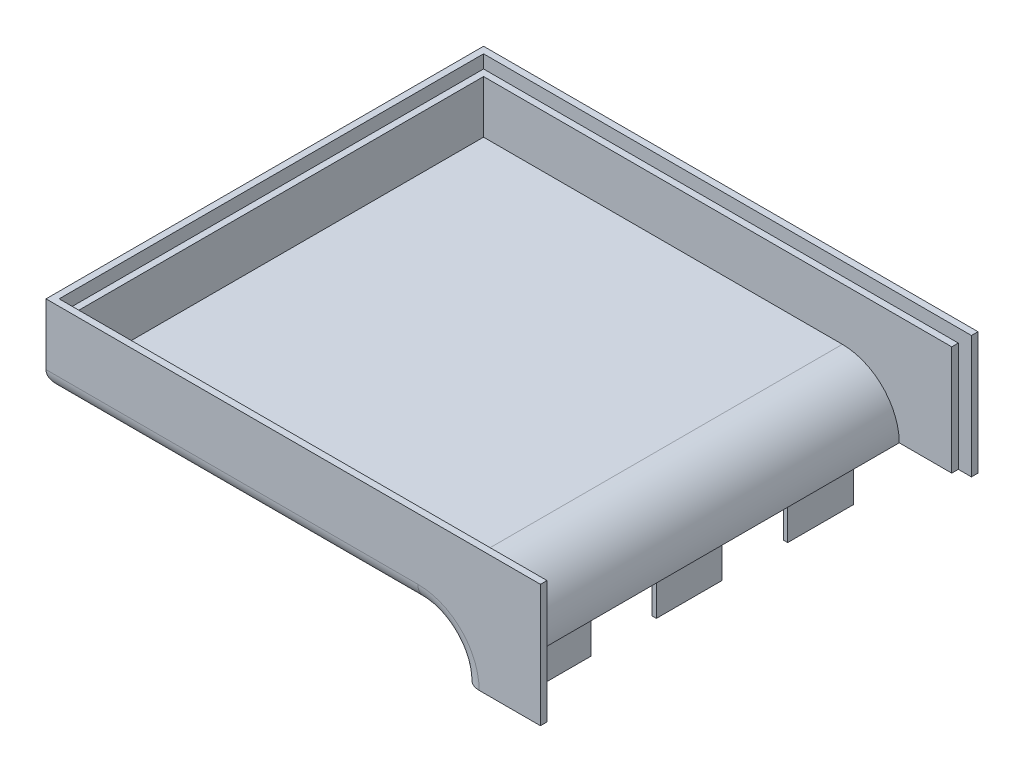
ISO-10303-21;
HEADER;
FILE_DESCRIPTION(('STEP AP214'),'2;1');
FILE_NAME('part.step','',(''),(''),'','','');
FILE_SCHEMA(('AUTOMOTIVE_DESIGN { 1 0 10303 214 1 1 1 1 }'));
ENDSEC;
DATA;
#1=APPLICATION_CONTEXT('core data for automotive mechanical design processes');
#2=APPLICATION_PROTOCOL_DEFINITION('international standard','automotive_design',2000,#1);
#3=PRODUCT_CONTEXT('',#1,'mechanical');
#4=PRODUCT('Part','Part','',(#3));
#5=PRODUCT_RELATED_PRODUCT_CATEGORY('part','',(#4));
#6=PRODUCT_DEFINITION_FORMATION('','',#4);
#7=PRODUCT_DEFINITION_CONTEXT('part definition',#1,'design');
#8=PRODUCT_DEFINITION('design','',#6,#7);
#9=PRODUCT_DEFINITION_SHAPE('','',#8);
#10=(LENGTH_UNIT() NAMED_UNIT(*) SI_UNIT(.MILLI.,.METRE.));
#11=(NAMED_UNIT(*) PLANE_ANGLE_UNIT() SI_UNIT($,.RADIAN.));
#12=(NAMED_UNIT(*) SI_UNIT($,.STERADIAN.) SOLID_ANGLE_UNIT());
#13=UNCERTAINTY_MEASURE_WITH_UNIT(LENGTH_MEASURE(1.E-05),#10,'distance_accuracy_value','');
#14=(GEOMETRIC_REPRESENTATION_CONTEXT(3) GLOBAL_UNCERTAINTY_ASSIGNED_CONTEXT((#13)) GLOBAL_UNIT_ASSIGNED_CONTEXT((#10,
#11,#12)) REPRESENTATION_CONTEXT('',''));
#15=CARTESIAN_POINT('',(0.,0.,0.));
#16=DIRECTION('',(0.,0.,1.));
#17=DIRECTION('',(1.,0.,0.));
#18=AXIS2_PLACEMENT_3D('',#15,#16,#17);
#19=CARTESIAN_POINT('',(0.,340.,0.));
#20=DIRECTION('',(0.,1.,0.));
#21=DIRECTION('',(0.,0.,1.));
#22=AXIS2_PLACEMENT_3D('',#19,#20,#21);
#23=PLANE('',#22);
#24=DIRECTION('',(0.,0.,-1.));
#25=VECTOR('',#24,1.);
#26=CARTESIAN_POINT('',(-14.,340.,57.5));
#27=LINE('',#26,#25);
#28=CARTESIAN_POINT('',(-14.,340.,57.5));
#29=VERTEX_POINT('',#28);
#30=CARTESIAN_POINT('',(-14.,340.,42.5));
#31=VERTEX_POINT('',#30);
#32=EDGE_CURVE('E270',#29,#31,#27,.T.);
#33=ORIENTED_EDGE('',*,*,#32,.F.);
#34=DIRECTION('',(-1.,0.,0.));
#35=VECTOR('',#34,1.);
#36=CARTESIAN_POINT('',(-14.,340.,57.5));
#37=LINE('',#36,#35);
#38=CARTESIAN_POINT('',(-13.,340.,57.5));
#39=VERTEX_POINT('',#38);
#40=EDGE_CURVE('E283',#39,#29,#37,.T.);
#41=ORIENTED_EDGE('',*,*,#40,.F.);
#42=DIRECTION('',(0.,0.,1.));
#43=VECTOR('',#42,1.);
#44=CARTESIAN_POINT('',(-13.,340.,57.5));
#45=LINE('',#44,#43);
#46=CARTESIAN_POINT('',(-13.,340.,42.5));
#47=VERTEX_POINT('',#46);
#48=EDGE_CURVE('E292',#47,#39,#45,.T.);
#49=ORIENTED_EDGE('',*,*,#48,.F.);
#50=DIRECTION('',(1.,0.,0.));
#51=VECTOR('',#50,1.);
#52=CARTESIAN_POINT('',(-14.,340.,42.5));
#53=LINE('',#52,#51);
#54=EDGE_CURVE('E273',#31,#47,#53,.T.);
#55=ORIENTED_EDGE('',*,*,#54,.F.);
#56=EDGE_LOOP('',(#33,#41,#49,#55));
#57=FACE_BOUND('',#56,.T.);
#58=CARTESIAN_POINT('',(-11.,340.,4.));
#59=DIRECTION('',(0.,1.,0.));
#60=DIRECTION('',(0.,0.,1.));
#61=AXIS2_PLACEMENT_3D('',#58,#59,#60);
#62=CIRCLE('',#61,4.);
#63=CARTESIAN_POINT('',(-11.,340.,0.));
#64=VERTEX_POINT('',#63);
#65=CARTESIAN_POINT('',(-15.,340.,4.));
#66=VERTEX_POINT('',#65);
#67=EDGE_CURVE('E354',#64,#66,#62,.T.);
#68=ORIENTED_EDGE('',*,*,#67,.F.);
#69=DIRECTION('',(1.,0.,0.));
#70=VECTOR('',#69,1.);
#71=CARTESIAN_POINT('',(-25.0000000000001,340.,0.));
#72=LINE('',#71,#70);
#73=CARTESIAN_POINT('',(3.,340.,0.));
#74=VERTEX_POINT('',#73);
#75=EDGE_CURVE('E474',#64,#74,#72,.T.);
#76=ORIENTED_EDGE('',*,*,#75,.T.);
#77=DIRECTION('',(0.,0.,1.));
#78=VECTOR('',#77,1.);
#79=CARTESIAN_POINT('',(3.,340.,0.));
#80=LINE('',#79,#78);
#81=CARTESIAN_POINT('',(3.,340.,1.5));
#82=VERTEX_POINT('',#81);
#83=EDGE_CURVE('E477',#74,#82,#80,.T.);
#84=ORIENTED_EDGE('',*,*,#83,.T.);
#85=DIRECTION('',(1.,0.,0.));
#86=VECTOR('',#85,1.);
#87=CARTESIAN_POINT('',(3.,340.,1.5));
#88=LINE('',#87,#86);
#89=CARTESIAN_POINT('',(0.,340.,1.5));
#90=VERTEX_POINT('',#89);
#91=EDGE_CURVE('E466',#90,#82,#88,.T.);
#92=ORIENTED_EDGE('',*,*,#91,.F.);
#93=DIRECTION('',(0.,0.,-1.));
#94=VECTOR('',#93,1.);
#95=CARTESIAN_POINT('',(0.,340.,100.));
#96=LINE('',#95,#94);
#97=CARTESIAN_POINT('',(0.,339.999997667742,3.));
#98=VERTEX_POINT('',#97);
#99=EDGE_CURVE('E470',#98,#90,#96,.T.);
#100=ORIENTED_EDGE('',*,*,#99,.F.);
#101=DIRECTION('',(-1.,0.,0.));
#102=VECTOR('',#101,1.);
#103=CARTESIAN_POINT('',(-25.0000000000001,339.999997667742,3.));
#104=LINE('',#103,#102);
#105=CARTESIAN_POINT('',(-12.,339.999997667742,3.));
#106=VERTEX_POINT('',#105);
#107=EDGE_CURVE('E483',#98,#106,#104,.T.);
#108=ORIENTED_EDGE('',*,*,#107,.T.);
#109=DIRECTION('',(0.,0.,1.));
#110=VECTOR('',#109,1.);
#111=CARTESIAN_POINT('',(-12.,340.,100.));
#112=LINE('',#111,#110);
#113=CARTESIAN_POINT('',(-12.,340.,97.));
#114=VERTEX_POINT('',#113);
#115=EDGE_CURVE('E415',#114,#106,#112,.F.);
#116=ORIENTED_EDGE('',*,*,#115,.F.);
#117=DIRECTION('',(-1.,0.,0.));
#118=VECTOR('',#117,1.);
#119=CARTESIAN_POINT('',(-25.0000000000001,340.,97.));
#120=LINE('',#119,#118);
#121=CARTESIAN_POINT('',(0.,340.,97.));
#122=VERTEX_POINT('',#121);
#123=EDGE_CURVE('E358',#122,#114,#120,.T.);
#124=ORIENTED_EDGE('',*,*,#123,.F.);
#125=DIRECTION('',(0.,0.,-1.));
#126=VECTOR('',#125,1.);
#127=CARTESIAN_POINT('',(0.,340.,100.));
#128=LINE('',#127,#126);
#129=CARTESIAN_POINT('',(0.,340.,98.5));
#130=VERTEX_POINT('',#129);
#131=EDGE_CURVE('E472',#130,#122,#128,.T.);
#132=ORIENTED_EDGE('',*,*,#131,.F.);
#133=DIRECTION('',(-1.,0.,0.));
#134=VECTOR('',#133,1.);
#135=CARTESIAN_POINT('',(-108.5,340.,98.5));
#136=LINE('',#135,#134);
#137=CARTESIAN_POINT('',(3.,340.,98.5));
#138=VERTEX_POINT('',#137);
#139=EDGE_CURVE('E464',#138,#130,#136,.T.);
#140=ORIENTED_EDGE('',*,*,#139,.F.);
#141=DIRECTION('',(0.,0.,1.));
#142=VECTOR('',#141,1.);
#143=CARTESIAN_POINT('',(3.,340.,0.));
#144=LINE('',#143,#142);
#145=CARTESIAN_POINT('',(3.,340.,100.));
#146=VERTEX_POINT('',#145);
#147=EDGE_CURVE('E480',#138,#146,#144,.T.);
#148=ORIENTED_EDGE('',*,*,#147,.T.);
#149=DIRECTION('',(1.,0.,0.));
#150=VECTOR('',#149,1.);
#151=CARTESIAN_POINT('',(-25.0000000000001,340.,100.));
#152=LINE('',#151,#150);
#153=CARTESIAN_POINT('',(-11.,340.,100.));
#154=VERTEX_POINT('',#153);
#155=EDGE_CURVE('E468',#154,#146,#152,.T.);
#156=ORIENTED_EDGE('',*,*,#155,.F.);
#157=CARTESIAN_POINT('',(-11.,340.,96.));
#158=DIRECTION('',(0.,-1.,0.));
#159=DIRECTION('',(0.,0.,-1.));
#160=AXIS2_PLACEMENT_3D('',#157,#158,#159);
#161=CIRCLE('',#160,4.);
#162=CARTESIAN_POINT('',(-15.,340.,96.));
#163=VERTEX_POINT('',#162);
#164=EDGE_CURVE('E341',#154,#163,#161,.T.);
#165=ORIENTED_EDGE('',*,*,#164,.T.);
#166=DIRECTION('',(0.,0.,-1.));
#167=VECTOR('',#166,1.);
#168=CARTESIAN_POINT('',(-15.,340.,100.));
#169=LINE('',#168,#167);
#170=EDGE_CURVE('E486',#163,#66,#169,.T.);
#171=ORIENTED_EDGE('',*,*,#170,.T.);
#172=EDGE_LOOP('',(#68,#76,#84,#92,#100,#108,#116,#124,#132,#140,#148,#156,#165,#171));
#173=FACE_BOUND('',#172,.T.);
#174=DIRECTION('',(0.,0.,-1.));
#175=VECTOR('',#174,1.);
#176=CARTESIAN_POINT('',(-14.,340.,87.5));
#177=LINE('',#176,#175);
#178=CARTESIAN_POINT('',(-14.,340.,87.5));
#179=VERTEX_POINT('',#178);
#180=CARTESIAN_POINT('',(-14.,340.,72.5));
#181=VERTEX_POINT('',#180);
#182=EDGE_CURVE('E308',#179,#181,#177,.T.);
#183=ORIENTED_EDGE('',*,*,#182,.F.);
#184=DIRECTION('',(-1.,0.,0.));
#185=VECTOR('',#184,1.);
#186=CARTESIAN_POINT('',(-14.,340.,87.5));
#187=LINE('',#186,#185);
#188=CARTESIAN_POINT('',(-13.,340.,87.5));
#189=VERTEX_POINT('',#188);
#190=EDGE_CURVE('E313',#189,#179,#187,.T.);
#191=ORIENTED_EDGE('',*,*,#190,.F.);
#192=DIRECTION('',(0.,0.,1.));
#193=VECTOR('',#192,1.);
#194=CARTESIAN_POINT('',(-13.,340.,87.5));
#195=LINE('',#194,#193);
#196=CARTESIAN_POINT('',(-13.,340.,72.5));
#197=VERTEX_POINT('',#196);
#198=EDGE_CURVE('E325',#197,#189,#195,.T.);
#199=ORIENTED_EDGE('',*,*,#198,.F.);
#200=DIRECTION('',(1.,0.,0.));
#201=VECTOR('',#200,1.);
#202=CARTESIAN_POINT('',(-14.,340.,72.5));
#203=LINE('',#202,#201);
#204=EDGE_CURVE('E322',#181,#197,#203,.T.);
#205=ORIENTED_EDGE('',*,*,#204,.F.);
#206=EDGE_LOOP('',(#183,#191,#199,#205));
#207=FACE_BOUND('',#206,.T.);
#208=DIRECTION('',(0.,0.,-1.));
#209=VECTOR('',#208,1.);
#210=CARTESIAN_POINT('',(-14.,340.,27.5));
#211=LINE('',#210,#209);
#212=CARTESIAN_POINT('',(-14.,340.,27.5));
#213=VERTEX_POINT('',#212);
#214=CARTESIAN_POINT('',(-14.,340.,12.5));
#215=VERTEX_POINT('',#214);
#216=EDGE_CURVE('E269',#213,#215,#211,.T.);
#217=ORIENTED_EDGE('',*,*,#216,.F.);
#218=DIRECTION('',(-1.,0.,0.));
#219=VECTOR('',#218,1.);
#220=CARTESIAN_POINT('',(-14.,340.,27.5));
#221=LINE('',#220,#219);
#222=CARTESIAN_POINT('',(-13.,340.,27.5));
#223=VERTEX_POINT('',#222);
#224=EDGE_CURVE('E266',#223,#213,#221,.T.);
#225=ORIENTED_EDGE('',*,*,#224,.F.);
#226=DIRECTION('',(0.,0.,1.));
#227=VECTOR('',#226,1.);
#228=CARTESIAN_POINT('',(-13.,340.,27.5));
#229=LINE('',#228,#227);
#230=CARTESIAN_POINT('',(-13.,340.,12.5));
#231=VERTEX_POINT('',#230);
#232=EDGE_CURVE('E55',#231,#223,#229,.T.);
#233=ORIENTED_EDGE('',*,*,#232,.F.);
#234=DIRECTION('',(1.,0.,0.));
#235=VECTOR('',#234,1.);
#236=CARTESIAN_POINT('',(-14.,340.,12.5));
#237=LINE('',#236,#235);
#238=EDGE_CURVE('E50',#215,#231,#237,.T.);
#239=ORIENTED_EDGE('',*,*,#238,.F.);
#240=EDGE_LOOP('',(#217,#225,#233,#239));
#241=FACE_BOUND('',#240,.T.);
#242=ADVANCED_FACE('F33',(#57,#173,#207,#241),#23,.F.);
#243=CARTESIAN_POINT('',(-106.,354.,100.));
#244=DIRECTION('',(0.,0.,-1.));
#245=DIRECTION('',(-1.,0.,0.));
#246=AXIS2_PLACEMENT_3D('',#243,#244,#245);
#247=CYLINDRICAL_SURFACE('',#246,4.);
#248=CARTESIAN_POINT('',(-106.,354.,96.));
#249=DIRECTION('',(-0.707106781186547,0.,-0.707106781186547));
#250=DIRECTION('',(0.707106781186547,0.,-0.707106781186547));
#251=AXIS2_PLACEMENT_3D('',#248,#249,#250);
#252=ELLIPSE('',#251,5.65685424949238,4.);
#253=CARTESIAN_POINT('',(-106.,350.,96.));
#254=VERTEX_POINT('',#253);
#255=CARTESIAN_POINT('',(-110.,354.,100.));
#256=VERTEX_POINT('',#255);
#257=EDGE_CURVE('E345',#254,#256,#252,.T.);
#258=ORIENTED_EDGE('',*,*,#257,.T.);
#259=DIRECTION('',(0.,0.,-1.));
#260=VECTOR('',#259,1.);
#261=CARTESIAN_POINT('',(-110.,354.,100.));
#262=LINE('',#261,#260);
#263=CARTESIAN_POINT('',(-110.,354.,0.));
#264=VERTEX_POINT('',#263);
#265=EDGE_CURVE('E355',#264,#256,#262,.F.);
#266=ORIENTED_EDGE('',*,*,#265,.F.);
#267=CARTESIAN_POINT('',(-106.,354.,4.));
#268=DIRECTION('',(-0.707106781186547,0.,0.707106781186547));
#269=DIRECTION('',(-0.707106781186547,0.,-0.707106781186547));
#270=AXIS2_PLACEMENT_3D('',#267,#268,#269);
#271=ELLIPSE('',#270,5.65685424949238,4.);
#272=CARTESIAN_POINT('',(-106.,350.,4.));
#273=VERTEX_POINT('',#272);
#274=EDGE_CURVE('E349',#273,#264,#271,.F.);
#275=ORIENTED_EDGE('',*,*,#274,.F.);
#276=DIRECTION('',(0.,0.,-1.));
#277=VECTOR('',#276,1.);
#278=CARTESIAN_POINT('',(-106.,350.,100.));
#279=LINE('',#278,#277);
#280=EDGE_CURVE('E360',#254,#273,#279,.T.);
#281=ORIENTED_EDGE('',*,*,#280,.F.);
#282=EDGE_LOOP('',(#258,#266,#275,#281));
#283=FACE_BOUND('',#282,.T.);
#284=ADVANCED_FACE('F599',(#283),#247,.T.);
#285=CARTESIAN_POINT('',(-110.,350.,100.));
#286=DIRECTION('',(0.,1.,0.));
#287=DIRECTION('',(-1.,0.,0.));
#288=AXIS2_PLACEMENT_3D('',#285,#286,#287);
#289=PLANE('',#288);
#290=DIRECTION('',(0.,0.,-1.));
#291=VECTOR('',#290,1.);
#292=CARTESIAN_POINT('',(-25.0000000000001,350.,100.));
#293=LINE('',#292,#291);
#294=CARTESIAN_POINT('',(-25.0000000000001,350.,96.));
#295=VERTEX_POINT('',#294);
#296=CARTESIAN_POINT('',(-25.0000000000001,350.,4.));
#297=VERTEX_POINT('',#296);
#298=EDGE_CURVE('E382',#295,#297,#293,.T.);
#299=ORIENTED_EDGE('',*,*,#298,.F.);
#300=DIRECTION('',(1.,0.,0.));
#301=VECTOR('',#300,1.);
#302=CARTESIAN_POINT('',(-110.,350.,96.));
#303=LINE('',#302,#301);
#304=EDGE_CURVE('E357',#295,#254,#303,.F.);
#305=ORIENTED_EDGE('',*,*,#304,.T.);
#306=ORIENTED_EDGE('',*,*,#280,.T.);
#307=DIRECTION('',(1.,0.,0.));
#308=VECTOR('',#307,1.);
#309=CARTESIAN_POINT('',(-25.0000000000001,350.,4.));
#310=LINE('',#309,#308);
#311=EDGE_CURVE('E362',#273,#297,#310,.T.);
#312=ORIENTED_EDGE('',*,*,#311,.T.);
#313=EDGE_LOOP('',(#299,#305,#306,#312));
#314=FACE_BOUND('',#313,.T.);
#315=ADVANCED_FACE('F577',(#314),#289,.F.);
#316=CARTESIAN_POINT('',(-110.,365.,100.));
#317=DIRECTION('',(1.,0.,0.));
#318=DIRECTION('',(0.,0.,-1.));
#319=AXIS2_PLACEMENT_3D('',#316,#317,#318);
#320=PLANE('',#319);
#321=DIRECTION('',(0.,-1.,0.));
#322=VECTOR('',#321,1.);
#323=CARTESIAN_POINT('',(-110.,365.,0.));
#324=LINE('',#323,#322);
#325=CARTESIAN_POINT('',(-110.,368.,0.));
#326=VERTEX_POINT('',#325);
#327=EDGE_CURVE('E386',#326,#264,#324,.T.);
#328=ORIENTED_EDGE('',*,*,#327,.T.);
#329=ORIENTED_EDGE('',*,*,#265,.T.);
#330=DIRECTION('',(0.,-1.,0.));
#331=VECTOR('',#330,1.);
#332=CARTESIAN_POINT('',(-110.,365.,100.));
#333=LINE('',#332,#331);
#334=CARTESIAN_POINT('',(-110.,368.,100.));
#335=VERTEX_POINT('',#334);
#336=EDGE_CURVE('E385',#335,#256,#333,.T.);
#337=ORIENTED_EDGE('',*,*,#336,.F.);
#338=DIRECTION('',(0.,0.,1.));
#339=VECTOR('',#338,1.);
#340=CARTESIAN_POINT('',(-110.,368.,0.));
#341=LINE('',#340,#339);
#342=EDGE_CURVE('E427',#326,#335,#341,.T.);
#343=ORIENTED_EDGE('',*,*,#342,.F.);
#344=EDGE_LOOP('',(#328,#329,#337,#343));
#345=FACE_BOUND('',#344,.T.);
#346=ADVANCED_FACE('F593',(#345),#320,.F.);
#347=CARTESIAN_POINT('',(-25.0000000000001,354.,96.));
#348=DIRECTION('',(1.,0.,0.));
#349=DIRECTION('',(0.,1.,0.));
#350=AXIS2_PLACEMENT_3D('',#347,#348,#349);
#351=CYLINDRICAL_SURFACE('',#350,4.);
#352=CARTESIAN_POINT('',(-25.0000000000001,354.,96.));
#353=DIRECTION('',(-1.,0.,0.));
#354=DIRECTION('',(0.,0.,1.));
#355=AXIS2_PLACEMENT_3D('',#352,#353,#354);
#356=CIRCLE('',#355,4.);
#357=CARTESIAN_POINT('',(-25.0000000000001,354.,100.));
#358=VERTEX_POINT('',#357);
#359=EDGE_CURVE('E342',#295,#358,#356,.T.);
#360=ORIENTED_EDGE('',*,*,#359,.T.);
#361=DIRECTION('',(1.,0.,0.));
#362=VECTOR('',#361,1.);
#363=CARTESIAN_POINT('',(-25.0000000000001,354.,100.));
#364=LINE('',#363,#362);
#365=EDGE_CURVE('E364',#256,#358,#364,.T.);
#366=ORIENTED_EDGE('',*,*,#365,.F.);
#367=ORIENTED_EDGE('',*,*,#257,.F.);
#368=ORIENTED_EDGE('',*,*,#304,.F.);
#369=EDGE_LOOP('',(#360,#366,#367,#368));
#370=FACE_BOUND('',#369,.T.);
#371=ADVANCED_FACE('F597',(#370),#351,.T.);
#372=CARTESIAN_POINT('',(-25.0000000000001,340.,100.));
#373=DIRECTION('',(0.,0.,-1.));
#374=DIRECTION('',(-1.,0.,0.));
#375=AXIS2_PLACEMENT_3D('',#372,#373,#374);
#376=CYLINDRICAL_SURFACE('',#375,10.0000000000001);
#377=ORIENTED_EDGE('',*,*,#298,.T.);
#378=CARTESIAN_POINT('',(-25.0000000000001,340.,4.));
#379=DIRECTION('',(0.,0.,-1.));
#380=DIRECTION('',(-1.,0.,0.));
#381=AXIS2_PLACEMENT_3D('',#378,#379,#380);
#382=CIRCLE('',#381,10.0000000000001);
#383=EDGE_CURVE('E374',#297,#66,#382,.T.);
#384=ORIENTED_EDGE('',*,*,#383,.T.);
#385=ORIENTED_EDGE('',*,*,#170,.F.);
#386=CARTESIAN_POINT('',(-25.0000000000001,340.,96.));
#387=DIRECTION('',(0.,0.,-1.));
#388=DIRECTION('',(-1.,0.,0.));
#389=AXIS2_PLACEMENT_3D('',#386,#387,#388);
#390=CIRCLE('',#389,10.0000000000001);
#391=EDGE_CURVE('E377',#163,#295,#390,.F.);
#392=ORIENTED_EDGE('',*,*,#391,.T.);
#393=EDGE_LOOP('',(#377,#384,#385,#392));
#394=FACE_BOUND('',#393,.T.);
#395=ADVANCED_FACE('F574',(#394),#376,.F.);
#396=CARTESIAN_POINT('',(-25.0000000000001,340.,97.));
#397=DIRECTION('',(0.,0.,-1.));
#398=DIRECTION('',(-1.,0.,0.));
#399=AXIS2_PLACEMENT_3D('',#396,#397,#398);
#400=PLANE('',#399);
#401=DIRECTION('',(0.,1.,0.));
#402=VECTOR('',#401,1.);
#403=CARTESIAN_POINT('',(0.,340.,97.));
#404=LINE('',#403,#402);
#405=CARTESIAN_POINT('',(0.,365.,97.));
#406=VERTEX_POINT('',#405);
#407=EDGE_CURVE('E37',#122,#406,#404,.T.);
#408=ORIENTED_EDGE('',*,*,#407,.F.);
#409=ORIENTED_EDGE('',*,*,#123,.T.);
#410=CARTESIAN_POINT('',(-25.0000000000001,340.,97.));
#411=DIRECTION('',(0.,0.,-1.));
#412=DIRECTION('',(-1.,0.,0.));
#413=AXIS2_PLACEMENT_3D('',#410,#411,#412);
#414=CIRCLE('',#413,13.0000000000001);
#415=CARTESIAN_POINT('',(-25.0000000000001,353.,97.));
#416=VERTEX_POINT('',#415);
#417=EDGE_CURVE('E410',#416,#114,#414,.T.);
#418=ORIENTED_EDGE('',*,*,#417,.F.);
#419=DIRECTION('',(1.,0.,0.));
#420=VECTOR('',#419,1.);
#421=CARTESIAN_POINT('',(-25.0000000000001,353.,97.));
#422=LINE('',#421,#420);
#423=CARTESIAN_POINT('',(-107.,353.,97.));
#424=VERTEX_POINT('',#423);
#425=EDGE_CURVE('E403',#424,#416,#422,.T.);
#426=ORIENTED_EDGE('',*,*,#425,.F.);
#427=DIRECTION('',(0.,-1.,0.));
#428=VECTOR('',#427,1.);
#429=CARTESIAN_POINT('',(-107.,340.,97.));
#430=LINE('',#429,#428);
#431=CARTESIAN_POINT('',(-107.,365.,97.));
#432=VERTEX_POINT('',#431);
#433=EDGE_CURVE('E395',#432,#424,#430,.T.);
#434=ORIENTED_EDGE('',*,*,#433,.F.);
#435=DIRECTION('',(-1.,0.,0.));
#436=VECTOR('',#435,1.);
#437=CARTESIAN_POINT('',(-25.0000000000001,365.,97.));
#438=LINE('',#437,#436);
#439=EDGE_CURVE('E392',#406,#432,#438,.T.);
#440=ORIENTED_EDGE('',*,*,#439,.F.);
#441=EDGE_LOOP('',(#408,#409,#418,#426,#434,#440));
#442=FACE_BOUND('',#441,.T.);
#443=ADVANCED_FACE('F536',(#442),#400,.T.);
#444=CARTESIAN_POINT('',(-25.0000000000001,340.,100.));
#445=DIRECTION('',(0.,0.,-1.));
#446=DIRECTION('',(-1.,0.,0.));
#447=AXIS2_PLACEMENT_3D('',#444,#445,#446);
#448=CYLINDRICAL_SURFACE('',#447,13.0000000000001);
#449=CARTESIAN_POINT('',(-25.0000000000001,340.,3.));
#450=DIRECTION('',(0.,0.,-1.));
#451=DIRECTION('',(-1.,0.,0.));
#452=AXIS2_PLACEMENT_3D('',#449,#450,#451);
#453=CIRCLE('',#452,13.0000000000001);
#454=CARTESIAN_POINT('',(-25.0000000000001,353.,3.));
#455=VERTEX_POINT('',#454);
#456=EDGE_CURVE('E412',#455,#106,#453,.T.);
#457=ORIENTED_EDGE('',*,*,#456,.F.);
#458=DIRECTION('',(0.,0.,-1.));
#459=VECTOR('',#458,1.);
#460=CARTESIAN_POINT('',(-25.0000000000001,353.,100.));
#461=LINE('',#460,#459);
#462=EDGE_CURVE('E408',#416,#455,#461,.T.);
#463=ORIENTED_EDGE('',*,*,#462,.F.);
#464=ORIENTED_EDGE('',*,*,#417,.T.);
#465=ORIENTED_EDGE('',*,*,#115,.T.);
#466=EDGE_LOOP('',(#457,#463,#464,#465));
#467=FACE_BOUND('',#466,.T.);
#468=ADVANCED_FACE('F548',(#467),#448,.T.);
#469=CARTESIAN_POINT('',(-110.,353.,100.));
#470=DIRECTION('',(0.,1.,0.));
#471=DIRECTION('',(-1.,0.,0.));
#472=AXIS2_PLACEMENT_3D('',#469,#470,#471);
#473=PLANE('',#472);
#474=DIRECTION('',(1.,0.,0.));
#475=VECTOR('',#474,1.);
#476=CARTESIAN_POINT('',(-25.0000000000001,353.,3.));
#477=LINE('',#476,#475);
#478=CARTESIAN_POINT('',(-107.,353.,3.));
#479=VERTEX_POINT('',#478);
#480=EDGE_CURVE('E405',#479,#455,#477,.T.);
#481=ORIENTED_EDGE('',*,*,#480,.F.);
#482=DIRECTION('',(0.,0.,-1.));
#483=VECTOR('',#482,1.);
#484=CARTESIAN_POINT('',(-107.,353.,100.));
#485=LINE('',#484,#483);
#486=EDGE_CURVE('E398',#424,#479,#485,.T.);
#487=ORIENTED_EDGE('',*,*,#486,.F.);
#488=ORIENTED_EDGE('',*,*,#425,.T.);
#489=ORIENTED_EDGE('',*,*,#462,.T.);
#490=EDGE_LOOP('',(#481,#487,#488,#489));
#491=FACE_BOUND('',#490,.T.);
#492=ADVANCED_FACE('F546',(#491),#473,.T.);
#493=CARTESIAN_POINT('',(-107.,365.,100.));
#494=DIRECTION('',(1.,0.,0.));
#495=DIRECTION('',(0.,0.,-1.));
#496=AXIS2_PLACEMENT_3D('',#493,#494,#495);
#497=PLANE('',#496);
#498=DIRECTION('',(0.,-1.,0.));
#499=VECTOR('',#498,1.);
#500=CARTESIAN_POINT('',(-107.,340.,3.));
#501=LINE('',#500,#499);
#502=CARTESIAN_POINT('',(-107.,365.,3.));
#503=VERTEX_POINT('',#502);
#504=EDGE_CURVE('E401',#503,#479,#501,.T.);
#505=ORIENTED_EDGE('',*,*,#504,.F.);
#506=DIRECTION('',(0.,0.,-1.));
#507=VECTOR('',#506,1.);
#508=CARTESIAN_POINT('',(-107.,365.,100.));
#509=LINE('',#508,#507);
#510=EDGE_CURVE('E389',#432,#503,#509,.T.);
#511=ORIENTED_EDGE('',*,*,#510,.F.);
#512=ORIENTED_EDGE('',*,*,#433,.T.);
#513=ORIENTED_EDGE('',*,*,#486,.T.);
#514=EDGE_LOOP('',(#505,#511,#512,#513));
#515=FACE_BOUND('',#514,.T.);
#516=ADVANCED_FACE('F541',(#515),#497,.T.);
#517=CARTESIAN_POINT('',(0.,0.,100.));
#518=DIRECTION('',(-1.,0.,0.));
#519=DIRECTION('',(0.,0.,1.));
#520=AXIS2_PLACEMENT_3D('',#517,#518,#519);
#521=PLANE('',#520);
#522=DIRECTION('',(0.,1.,0.));
#523=VECTOR('',#522,1.);
#524=CARTESIAN_POINT('',(0.,340.,3.));
#525=LINE('',#524,#523);
#526=CARTESIAN_POINT('',(0.,365.,3.));
#527=VERTEX_POINT('',#526);
#528=EDGE_CURVE('E346',#98,#527,#525,.T.);
#529=ORIENTED_EDGE('',*,*,#528,.F.);
#530=ORIENTED_EDGE('',*,*,#99,.T.);
#531=DIRECTION('',(0.,-1.,0.));
#532=VECTOR('',#531,1.);
#533=CARTESIAN_POINT('',(0.,1.5,1.5));
#534=LINE('',#533,#532);
#535=CARTESIAN_POINT('',(0.,365.,1.5));
#536=VERTEX_POINT('',#535);
#537=EDGE_CURVE('E424',#536,#90,#534,.T.);
#538=ORIENTED_EDGE('',*,*,#537,.F.);
#539=DIRECTION('',(0.,0.,-1.));
#540=VECTOR('',#539,1.);
#541=CARTESIAN_POINT('',(0.,365.,100.));
#542=LINE('',#541,#540);
#543=EDGE_CURVE('E381',#527,#536,#542,.T.);
#544=ORIENTED_EDGE('',*,*,#543,.F.);
#545=EDGE_LOOP('',(#529,#530,#538,#544));
#546=FACE_BOUND('',#545,.T.);
#547=ADVANCED_FACE('F510',(#546),#521,.F.);
#548=CARTESIAN_POINT('',(3.,1.5,1.5));
#549=DIRECTION('',(0.,0.,-1.));
#550=DIRECTION('',(-1.,0.,0.));
#551=AXIS2_PLACEMENT_3D('',#548,#549,#550);
#552=PLANE('',#551);
#553=ORIENTED_EDGE('',*,*,#537,.T.);
#554=ORIENTED_EDGE('',*,*,#91,.T.);
#555=DIRECTION('',(0.,-1.,0.));
#556=VECTOR('',#555,1.);
#557=CARTESIAN_POINT('',(3.,1.5,1.5));
#558=LINE('',#557,#556);
#559=CARTESIAN_POINT('',(3.,368.,1.5));
#560=VERTEX_POINT('',#559);
#561=EDGE_CURVE('E460',#560,#82,#558,.T.);
#562=ORIENTED_EDGE('',*,*,#561,.F.);
#563=DIRECTION('',(1.,0.,0.));
#564=VECTOR('',#563,1.);
#565=CARTESIAN_POINT('',(3.,368.,1.5));
#566=LINE('',#565,#564);
#567=CARTESIAN_POINT('',(-108.5,368.,1.5));
#568=VERTEX_POINT('',#567);
#569=EDGE_CURVE('E447',#568,#560,#566,.T.);
#570=ORIENTED_EDGE('',*,*,#569,.F.);
#571=DIRECTION('',(0.,-1.,0.));
#572=VECTOR('',#571,1.);
#573=CARTESIAN_POINT('',(-108.5,368.,1.5));
#574=LINE('',#573,#572);
#575=CARTESIAN_POINT('',(-108.5,365.,1.5));
#576=VERTEX_POINT('',#575);
#577=EDGE_CURVE('E423',#568,#576,#574,.T.);
#578=ORIENTED_EDGE('',*,*,#577,.T.);
#579=DIRECTION('',(1.,0.,0.));
#580=VECTOR('',#579,1.);
#581=CARTESIAN_POINT('',(3.,365.,1.5));
#582=LINE('',#581,#580);
#583=EDGE_CURVE('E428',#576,#536,#582,.T.);
#584=ORIENTED_EDGE('',*,*,#583,.T.);
#585=EDGE_LOOP('',(#553,#554,#562,#570,#578,#584));
#586=FACE_BOUND('',#585,.T.);
#587=ADVANCED_FACE('F513',(#586),#552,.F.);
#588=CARTESIAN_POINT('',(-108.5,368.,1.5));
#589=DIRECTION('',(-1.,0.,0.));
#590=DIRECTION('',(0.,0.,1.));
#591=AXIS2_PLACEMENT_3D('',#588,#589,#590);
#592=PLANE('',#591);
#593=DIRECTION('',(0.,0.,-1.));
#594=VECTOR('',#593,1.);
#595=CARTESIAN_POINT('',(-108.5,365.,1.5));
#596=LINE('',#595,#594);
#597=CARTESIAN_POINT('',(-108.5,365.,98.5));
#598=VERTEX_POINT('',#597);
#599=EDGE_CURVE('E431',#598,#576,#596,.T.);
#600=ORIENTED_EDGE('',*,*,#599,.T.);
#601=ORIENTED_EDGE('',*,*,#577,.F.);
#602=DIRECTION('',(0.,0.,-1.));
#603=VECTOR('',#602,1.);
#604=CARTESIAN_POINT('',(-108.5,368.,1.5));
#605=LINE('',#604,#603);
#606=CARTESIAN_POINT('',(-108.5,368.,98.5));
#607=VERTEX_POINT('',#606);
#608=EDGE_CURVE('E450',#607,#568,#605,.T.);
#609=ORIENTED_EDGE('',*,*,#608,.F.);
#610=DIRECTION('',(0.,-1.,0.));
#611=VECTOR('',#610,1.);
#612=CARTESIAN_POINT('',(-108.5,368.,98.5));
#613=LINE('',#612,#611);
#614=EDGE_CURVE('E420',#607,#598,#613,.T.);
#615=ORIENTED_EDGE('',*,*,#614,.T.);
#616=EDGE_LOOP('',(#600,#601,#609,#615));
#617=FACE_BOUND('',#616,.T.);
#618=ADVANCED_FACE('F518',(#617),#592,.F.);
#619=CARTESIAN_POINT('',(0.,365.,100.));
#620=DIRECTION('',(0.,-1.,0.));
#621=DIRECTION('',(0.,0.,-1.));
#622=AXIS2_PLACEMENT_3D('',#619,#620,#621);
#623=PLANE('',#622);
#624=ORIENTED_EDGE('',*,*,#583,.F.);
#625=ORIENTED_EDGE('',*,*,#599,.F.);
#626=DIRECTION('',(-1.,0.,0.));
#627=VECTOR('',#626,1.);
#628=CARTESIAN_POINT('',(-108.5,365.,98.5));
#629=LINE('',#628,#627);
#630=CARTESIAN_POINT('',(0.,365.,98.5));
#631=VERTEX_POINT('',#630);
#632=EDGE_CURVE('E435',#631,#598,#629,.T.);
#633=ORIENTED_EDGE('',*,*,#632,.F.);
#634=EDGE_CURVE('E379',#631,#406,#542,.T.);
#635=ORIENTED_EDGE('',*,*,#634,.T.);
#636=ORIENTED_EDGE('',*,*,#439,.T.);
#637=ORIENTED_EDGE('',*,*,#510,.T.);
#638=DIRECTION('',(-1.,0.,0.));
#639=VECTOR('',#638,1.);
#640=CARTESIAN_POINT('',(-25.0000000000001,365.,3.));
#641=LINE('',#640,#639);
#642=EDGE_CURVE('E399',#527,#503,#641,.T.);
#643=ORIENTED_EDGE('',*,*,#642,.F.);
#644=ORIENTED_EDGE('',*,*,#543,.T.);
#645=EDGE_LOOP('',(#624,#625,#633,#635,#636,#637,#643,#644));
#646=FACE_BOUND('',#645,.T.);
#647=ADVANCED_FACE('F508',(#646),#623,.F.);
#648=DIRECTION('',(0.,1.,0.));
#649=VECTOR('',#648,1.);
#650=CARTESIAN_POINT('',(0.,1.5,98.5));
#651=LINE('',#650,#649);
#652=EDGE_CURVE('E11',#130,#631,#651,.T.);
#653=ORIENTED_EDGE('',*,*,#652,.F.);
#654=ORIENTED_EDGE('',*,*,#131,.T.);
#655=ORIENTED_EDGE('',*,*,#407,.T.);
#656=ORIENTED_EDGE('',*,*,#634,.F.);
#657=EDGE_LOOP('',(#653,#654,#655,#656));
#658=FACE_BOUND('',#657,.T.);
#659=ADVANCED_FACE('F530',(#658),#521,.F.);
#660=CARTESIAN_POINT('',(-25.0000000000001,340.,100.));
#661=DIRECTION('',(0.,0.,-1.));
#662=DIRECTION('',(-1.,0.,0.));
#663=AXIS2_PLACEMENT_3D('',#660,#661,#662);
#664=PLANE('',#663);
#665=CARTESIAN_POINT('',(-25.0000000000001,340.,100.));
#666=DIRECTION('',(0.,0.,-1.));
#667=DIRECTION('',(-1.,0.,0.));
#668=AXIS2_PLACEMENT_3D('',#665,#666,#667);
#669=CIRCLE('',#668,14.0000000000001);
#670=EDGE_CURVE('E366',#358,#154,#669,.T.);
#671=ORIENTED_EDGE('',*,*,#670,.T.);
#672=ORIENTED_EDGE('',*,*,#155,.T.);
#673=DIRECTION('',(0.,-1.,0.));
#674=VECTOR('',#673,1.);
#675=CARTESIAN_POINT('',(3.,0.,100.));
#676=LINE('',#675,#674);
#677=CARTESIAN_POINT('',(3.,368.,100.));
#678=VERTEX_POINT('',#677);
#679=EDGE_CURVE('E438',#678,#146,#676,.T.);
#680=ORIENTED_EDGE('',*,*,#679,.F.);
#681=DIRECTION('',(1.,0.,0.));
#682=VECTOR('',#681,1.);
#683=CARTESIAN_POINT('',(-110.,368.,100.));
#684=LINE('',#683,#682);
#685=EDGE_CURVE('E432',#335,#678,#684,.T.);
#686=ORIENTED_EDGE('',*,*,#685,.F.);
#687=ORIENTED_EDGE('',*,*,#336,.T.);
#688=ORIENTED_EDGE('',*,*,#365,.T.);
#689=EDGE_LOOP('',(#671,#672,#680,#686,#687,#688));
#690=FACE_BOUND('',#689,.T.);
#691=ADVANCED_FACE('F563',(#690),#664,.F.);
#692=CARTESIAN_POINT('',(0.,368.,0.));
#693=DIRECTION('',(0.,-1.,0.));
#694=DIRECTION('',(0.,0.,-1.));
#695=AXIS2_PLACEMENT_3D('',#692,#693,#694);
#696=PLANE('',#695);
#697=ORIENTED_EDGE('',*,*,#685,.T.);
#698=DIRECTION('',(0.,0.,1.));
#699=VECTOR('',#698,1.);
#700=CARTESIAN_POINT('',(3.,368.,100.));
#701=LINE('',#700,#699);
#702=CARTESIAN_POINT('',(3.,368.,98.5));
#703=VERTEX_POINT('',#702);
#704=EDGE_CURVE('E455',#703,#678,#701,.T.);
#705=ORIENTED_EDGE('',*,*,#704,.F.);
#706=DIRECTION('',(-1.,0.,0.));
#707=VECTOR('',#706,1.);
#708=CARTESIAN_POINT('',(-108.5,368.,98.5));
#709=LINE('',#708,#707);
#710=EDGE_CURVE('E452',#703,#607,#709,.T.);
#711=ORIENTED_EDGE('',*,*,#710,.T.);
#712=ORIENTED_EDGE('',*,*,#608,.T.);
#713=ORIENTED_EDGE('',*,*,#569,.T.);
#714=DIRECTION('',(0.,0.,-1.));
#715=VECTOR('',#714,1.);
#716=CARTESIAN_POINT('',(3.,368.,0.));
#717=LINE('',#716,#715);
#718=CARTESIAN_POINT('',(3.,368.,0.));
#719=VERTEX_POINT('',#718);
#720=EDGE_CURVE('E444',#560,#719,#717,.T.);
#721=ORIENTED_EDGE('',*,*,#720,.T.);
#722=DIRECTION('',(-1.,0.,0.));
#723=VECTOR('',#722,1.);
#724=CARTESIAN_POINT('',(3.,368.,0.));
#725=LINE('',#724,#723);
#726=EDGE_CURVE('E441',#719,#326,#725,.T.);
#727=ORIENTED_EDGE('',*,*,#726,.T.);
#728=ORIENTED_EDGE('',*,*,#342,.T.);
#729=EDGE_LOOP('',(#697,#705,#711,#712,#713,#721,#727,#728));
#730=FACE_BOUND('',#729,.T.);
#731=ADVANCED_FACE('F556',(#730),#696,.F.);
#732=CARTESIAN_POINT('',(-108.5,368.,98.5));
#733=DIRECTION('',(0.,0.,1.));
#734=DIRECTION('',(1.,0.,0.));
#735=AXIS2_PLACEMENT_3D('',#732,#733,#734);
#736=PLANE('',#735);
#737=DIRECTION('',(0.,1.,0.));
#738=VECTOR('',#737,1.);
#739=CARTESIAN_POINT('',(3.,1.5,98.5));
#740=LINE('',#739,#738);
#741=EDGE_CURVE('E42',#138,#703,#740,.T.);
#742=ORIENTED_EDGE('',*,*,#741,.F.);
#743=ORIENTED_EDGE('',*,*,#139,.T.);
#744=ORIENTED_EDGE('',*,*,#652,.T.);
#745=ORIENTED_EDGE('',*,*,#632,.T.);
#746=ORIENTED_EDGE('',*,*,#614,.F.);
#747=ORIENTED_EDGE('',*,*,#710,.F.);
#748=EDGE_LOOP('',(#742,#743,#744,#745,#746,#747));
#749=FACE_BOUND('',#748,.T.);
#750=ADVANCED_FACE('F524',(#749),#736,.F.);
#751=CARTESIAN_POINT('',(3.,0.,0.));
#752=DIRECTION('',(1.,0.,0.));
#753=DIRECTION('',(0.,0.,-1.));
#754=AXIS2_PLACEMENT_3D('',#751,#752,#753);
#755=PLANE('',#754);
#756=ORIENTED_EDGE('',*,*,#147,.F.);
#757=ORIENTED_EDGE('',*,*,#741,.T.);
#758=ORIENTED_EDGE('',*,*,#704,.T.);
#759=ORIENTED_EDGE('',*,*,#679,.T.);
#760=EDGE_LOOP('',(#756,#757,#758,#759));
#761=FACE_BOUND('',#760,.T.);
#762=ADVANCED_FACE('F561',(#761),#755,.T.);
#763=CARTESIAN_POINT('',(-25.0000000000001,340.,0.));
#764=DIRECTION('',(0.,0.,-1.));
#765=DIRECTION('',(-1.,0.,0.));
#766=AXIS2_PLACEMENT_3D('',#763,#764,#765);
#767=PLANE('',#766);
#768=ORIENTED_EDGE('',*,*,#75,.F.);
#769=CARTESIAN_POINT('',(-25.0000000000001,340.,0.));
#770=DIRECTION('',(0.,0.,-1.));
#771=DIRECTION('',(-1.,0.,0.));
#772=AXIS2_PLACEMENT_3D('',#769,#770,#771);
#773=CIRCLE('',#772,14.0000000000001);
#774=CARTESIAN_POINT('',(-25.0000000000001,354.,0.));
#775=VERTEX_POINT('',#774);
#776=EDGE_CURVE('E369',#64,#775,#773,.F.);
#777=ORIENTED_EDGE('',*,*,#776,.T.);
#778=DIRECTION('',(1.,0.,0.));
#779=VECTOR('',#778,1.);
#780=CARTESIAN_POINT('',(-110.,354.,0.));
#781=LINE('',#780,#779);
#782=EDGE_CURVE('E372',#775,#264,#781,.F.);
#783=ORIENTED_EDGE('',*,*,#782,.T.);
#784=ORIENTED_EDGE('',*,*,#327,.F.);
#785=ORIENTED_EDGE('',*,*,#726,.F.);
#786=DIRECTION('',(0.,1.,0.));
#787=VECTOR('',#786,1.);
#788=CARTESIAN_POINT('',(3.,0.,0.));
#789=LINE('',#788,#787);
#790=EDGE_CURVE('E492',#74,#719,#789,.T.);
#791=ORIENTED_EDGE('',*,*,#790,.F.);
#792=EDGE_LOOP('',(#768,#777,#783,#784,#785,#791));
#793=FACE_BOUND('',#792,.T.);
#794=ADVANCED_FACE('F590',(#793),#767,.T.);
#795=CARTESIAN_POINT('',(3.,0.,0.));
#796=DIRECTION('',(1.,0.,0.));
#797=DIRECTION('',(0.,1.,0.));
#798=AXIS2_PLACEMENT_3D('',#795,#796,#797);
#799=PLANE('',#798);
#800=ORIENTED_EDGE('',*,*,#83,.F.);
#801=ORIENTED_EDGE('',*,*,#790,.T.);
#802=ORIENTED_EDGE('',*,*,#720,.F.);
#803=ORIENTED_EDGE('',*,*,#561,.T.);
#804=EDGE_LOOP('',(#800,#801,#802,#803));
#805=FACE_BOUND('',#804,.T.);
#806=ADVANCED_FACE('F35',(#805),#799,.T.);
#807=CARTESIAN_POINT('',(-25.0000000000001,340.,3.));
#808=DIRECTION('',(0.,0.,-1.));
#809=DIRECTION('',(-1.,0.,0.));
#810=AXIS2_PLACEMENT_3D('',#807,#808,#809);
#811=PLANE('',#810);
#812=ORIENTED_EDGE('',*,*,#107,.F.);
#813=ORIENTED_EDGE('',*,*,#528,.T.);
#814=ORIENTED_EDGE('',*,*,#642,.T.);
#815=ORIENTED_EDGE('',*,*,#504,.T.);
#816=ORIENTED_EDGE('',*,*,#480,.T.);
#817=ORIENTED_EDGE('',*,*,#456,.T.);
#818=EDGE_LOOP('',(#812,#813,#814,#815,#816,#817));
#819=FACE_BOUND('',#818,.T.);
#820=ADVANCED_FACE('F501',(#819),#811,.F.);
#821=CARTESIAN_POINT('',(-110.,354.,4.));
#822=DIRECTION('',(-1.,0.,0.));
#823=DIRECTION('',(0.,-1.,0.));
#824=AXIS2_PLACEMENT_3D('',#821,#822,#823);
#825=CYLINDRICAL_SURFACE('',#824,4.);
#826=ORIENTED_EDGE('',*,*,#274,.T.);
#827=ORIENTED_EDGE('',*,*,#782,.F.);
#828=CARTESIAN_POINT('',(-25.0000000000001,354.,4.));
#829=DIRECTION('',(1.,0.,0.));
#830=DIRECTION('',(0.,0.,-1.));
#831=AXIS2_PLACEMENT_3D('',#828,#829,#830);
#832=CIRCLE('',#831,4.);
#833=EDGE_CURVE('E352',#297,#775,#832,.T.);
#834=ORIENTED_EDGE('',*,*,#833,.F.);
#835=ORIENTED_EDGE('',*,*,#311,.F.);
#836=EDGE_LOOP('',(#826,#827,#834,#835));
#837=FACE_BOUND('',#836,.T.);
#838=ADVANCED_FACE('F583',(#837),#825,.T.);
#839=CARTESIAN_POINT('',(-25.0000000000001,340.,4.));
#840=DIRECTION('',(0.,0.,-1.));
#841=DIRECTION('',(-1.,0.,0.));
#842=AXIS2_PLACEMENT_3D('',#839,#840,#841);
#843=TOROIDAL_SURFACE('',#842,14.0000000000001,4.);
#844=ORIENTED_EDGE('',*,*,#833,.T.);
#845=ORIENTED_EDGE('',*,*,#776,.F.);
#846=ORIENTED_EDGE('',*,*,#67,.T.);
#847=ORIENTED_EDGE('',*,*,#383,.F.);
#848=EDGE_LOOP('',(#844,#845,#846,#847));
#849=FACE_BOUND('',#848,.T.);
#850=ADVANCED_FACE('F588',(#849),#843,.T.);
#851=CARTESIAN_POINT('',(-25.0000000000001,340.,96.));
#852=DIRECTION('',(0.,0.,-1.));
#853=DIRECTION('',(-1.,0.,0.));
#854=AXIS2_PLACEMENT_3D('',#851,#852,#853);
#855=TOROIDAL_SURFACE('',#854,14.0000000000001,4.);
#856=ORIENTED_EDGE('',*,*,#164,.F.);
#857=ORIENTED_EDGE('',*,*,#670,.F.);
#858=ORIENTED_EDGE('',*,*,#359,.F.);
#859=ORIENTED_EDGE('',*,*,#391,.F.);
#860=EDGE_LOOP('',(#856,#857,#858,#859));
#861=FACE_BOUND('',#860,.T.);
#862=ADVANCED_FACE('F570',(#861),#855,.T.);
#863=CARTESIAN_POINT('',(-14.,332.,87.5));
#864=DIRECTION('',(1.,0.,0.));
#865=DIRECTION('',(0.,0.,-1.));
#866=AXIS2_PLACEMENT_3D('',#863,#864,#865);
#867=PLANE('',#866);
#868=ORIENTED_EDGE('',*,*,#182,.T.);
#869=DIRECTION('',(0.,1.,0.));
#870=VECTOR('',#869,1.);
#871=CARTESIAN_POINT('',(-14.,332.,72.5));
#872=LINE('',#871,#870);
#873=CARTESIAN_POINT('',(-14.,332.,72.5));
#874=VERTEX_POINT('',#873);
#875=EDGE_CURVE('E338',#874,#181,#872,.T.);
#876=ORIENTED_EDGE('',*,*,#875,.F.);
#877=DIRECTION('',(0.,0.,-1.));
#878=VECTOR('',#877,1.);
#879=CARTESIAN_POINT('',(-14.,332.,87.5));
#880=LINE('',#879,#878);
#881=CARTESIAN_POINT('',(-14.,332.,87.5));
#882=VERTEX_POINT('',#881);
#883=EDGE_CURVE('E309',#882,#874,#880,.T.);
#884=ORIENTED_EDGE('',*,*,#883,.F.);
#885=DIRECTION('',(0.,1.,0.));
#886=VECTOR('',#885,1.);
#887=CARTESIAN_POINT('',(-14.,332.,87.5));
#888=LINE('',#887,#886);
#889=EDGE_CURVE('E319',#882,#179,#888,.T.);
#890=ORIENTED_EDGE('',*,*,#889,.T.);
#891=EDGE_LOOP('',(#868,#876,#884,#890));
#892=FACE_BOUND('',#891,.T.);
#893=ADVANCED_FACE('F602',(#892),#867,.F.);
#894=CARTESIAN_POINT('',(-14.,332.,72.5));
#895=DIRECTION('',(0.,0.,1.));
#896=DIRECTION('',(1.,0.,0.));
#897=AXIS2_PLACEMENT_3D('',#894,#895,#896);
#898=PLANE('',#897);
#899=ORIENTED_EDGE('',*,*,#204,.T.);
#900=DIRECTION('',(0.,1.,0.));
#901=VECTOR('',#900,1.);
#902=CARTESIAN_POINT('',(-13.,332.,72.5));
#903=LINE('',#902,#901);
#904=CARTESIAN_POINT('',(-13.,332.,72.5));
#905=VERTEX_POINT('',#904);
#906=EDGE_CURVE('E335',#905,#197,#903,.T.);
#907=ORIENTED_EDGE('',*,*,#906,.F.);
#908=DIRECTION('',(1.,0.,0.));
#909=VECTOR('',#908,1.);
#910=CARTESIAN_POINT('',(-14.,332.,72.5));
#911=LINE('',#910,#909);
#912=EDGE_CURVE('E312',#874,#905,#911,.T.);
#913=ORIENTED_EDGE('',*,*,#912,.F.);
#914=ORIENTED_EDGE('',*,*,#875,.T.);
#915=EDGE_LOOP('',(#899,#907,#913,#914));
#916=FACE_BOUND('',#915,.T.);
#917=ADVANCED_FACE('F613',(#916),#898,.F.);
#918=CARTESIAN_POINT('',(-13.,332.,87.5));
#919=DIRECTION('',(-1.,0.,0.));
#920=DIRECTION('',(0.,0.,1.));
#921=AXIS2_PLACEMENT_3D('',#918,#919,#920);
#922=PLANE('',#921);
#923=ORIENTED_EDGE('',*,*,#198,.T.);
#924=DIRECTION('',(0.,1.,0.));
#925=VECTOR('',#924,1.);
#926=CARTESIAN_POINT('',(-13.,332.,87.5));
#927=LINE('',#926,#925);
#928=CARTESIAN_POINT('',(-13.,332.,87.5));
#929=VERTEX_POINT('',#928);
#930=EDGE_CURVE('E332',#929,#189,#927,.T.);
#931=ORIENTED_EDGE('',*,*,#930,.F.);
#932=DIRECTION('',(0.,0.,1.));
#933=VECTOR('',#932,1.);
#934=CARTESIAN_POINT('',(-13.,332.,87.5));
#935=LINE('',#934,#933);
#936=EDGE_CURVE('E315',#905,#929,#935,.T.);
#937=ORIENTED_EDGE('',*,*,#936,.F.);
#938=ORIENTED_EDGE('',*,*,#906,.T.);
#939=EDGE_LOOP('',(#923,#931,#937,#938));
#940=FACE_BOUND('',#939,.T.);
#941=ADVANCED_FACE('F620',(#940),#922,.F.);
#942=CARTESIAN_POINT('',(-14.,332.,87.5));
#943=DIRECTION('',(0.,0.,-1.));
#944=DIRECTION('',(-1.,0.,0.));
#945=AXIS2_PLACEMENT_3D('',#942,#943,#944);
#946=PLANE('',#945);
#947=ORIENTED_EDGE('',*,*,#190,.T.);
#948=ORIENTED_EDGE('',*,*,#889,.F.);
#949=DIRECTION('',(-1.,0.,0.));
#950=VECTOR('',#949,1.);
#951=CARTESIAN_POINT('',(-14.,332.,87.5));
#952=LINE('',#951,#950);
#953=EDGE_CURVE('E317',#929,#882,#952,.T.);
#954=ORIENTED_EDGE('',*,*,#953,.F.);
#955=ORIENTED_EDGE('',*,*,#930,.T.);
#956=EDGE_LOOP('',(#947,#948,#954,#955));
#957=FACE_BOUND('',#956,.T.);
#958=ADVANCED_FACE('F709',(#957),#946,.F.);
#959=CARTESIAN_POINT('',(0.,332.,0.));
#960=DIRECTION('',(0.,-1.,0.));
#961=DIRECTION('',(0.,0.,-1.));
#962=AXIS2_PLACEMENT_3D('',#959,#960,#961);
#963=PLANE('',#962);
#964=ORIENTED_EDGE('',*,*,#883,.T.);
#965=ORIENTED_EDGE('',*,*,#912,.T.);
#966=ORIENTED_EDGE('',*,*,#936,.T.);
#967=ORIENTED_EDGE('',*,*,#953,.T.);
#968=EDGE_LOOP('',(#964,#965,#966,#967));
#969=FACE_BOUND('',#968,.T.);
#970=ADVANCED_FACE('F718',(#969),#963,.T.);
#971=CARTESIAN_POINT('',(-14.,332.,57.5));
#972=DIRECTION('',(1.,0.,0.));
#973=DIRECTION('',(0.,0.,-1.));
#974=AXIS2_PLACEMENT_3D('',#971,#972,#973);
#975=PLANE('',#974);
#976=ORIENTED_EDGE('',*,*,#32,.T.);
#977=DIRECTION('',(0.,1.,0.));
#978=VECTOR('',#977,1.);
#979=CARTESIAN_POINT('',(-14.,332.,42.5));
#980=LINE('',#979,#978);
#981=CARTESIAN_POINT('',(-14.,332.,42.5));
#982=VERTEX_POINT('',#981);
#983=EDGE_CURVE('E305',#982,#31,#980,.T.);
#984=ORIENTED_EDGE('',*,*,#983,.F.);
#985=DIRECTION('',(0.,0.,-1.));
#986=VECTOR('',#985,1.);
#987=CARTESIAN_POINT('',(-14.,332.,57.5));
#988=LINE('',#987,#986);
#989=CARTESIAN_POINT('',(-14.,332.,57.5));
#990=VERTEX_POINT('',#989);
#991=EDGE_CURVE('E279',#990,#982,#988,.T.);
#992=ORIENTED_EDGE('',*,*,#991,.F.);
#993=DIRECTION('',(0.,1.,0.));
#994=VECTOR('',#993,1.);
#995=CARTESIAN_POINT('',(-14.,332.,57.5));
#996=LINE('',#995,#994);
#997=EDGE_CURVE('E288',#990,#29,#996,.T.);
#998=ORIENTED_EDGE('',*,*,#997,.T.);
#999=EDGE_LOOP('',(#976,#984,#992,#998));
#1000=FACE_BOUND('',#999,.T.);
#1001=ADVANCED_FACE('F728',(#1000),#975,.F.);
#1002=CARTESIAN_POINT('',(-14.,332.,42.5));
#1003=DIRECTION('',(0.,0.,1.));
#1004=DIRECTION('',(1.,0.,0.));
#1005=AXIS2_PLACEMENT_3D('',#1002,#1003,#1004);
#1006=PLANE('',#1005);
#1007=ORIENTED_EDGE('',*,*,#54,.T.);
#1008=DIRECTION('',(0.,1.,0.));
#1009=VECTOR('',#1008,1.);
#1010=CARTESIAN_POINT('',(-13.,332.,42.5));
#1011=LINE('',#1010,#1009);
#1012=CARTESIAN_POINT('',(-13.,332.,42.5));
#1013=VERTEX_POINT('',#1012);
#1014=EDGE_CURVE('E302',#1013,#47,#1011,.T.);
#1015=ORIENTED_EDGE('',*,*,#1014,.F.);
#1016=DIRECTION('',(1.,0.,0.));
#1017=VECTOR('',#1016,1.);
#1018=CARTESIAN_POINT('',(-14.,332.,42.5));
#1019=LINE('',#1018,#1017);
#1020=EDGE_CURVE('E282',#982,#1013,#1019,.T.);
#1021=ORIENTED_EDGE('',*,*,#1020,.F.);
#1022=ORIENTED_EDGE('',*,*,#983,.T.);
#1023=EDGE_LOOP('',(#1007,#1015,#1021,#1022));
#1024=FACE_BOUND('',#1023,.T.);
#1025=ADVANCED_FACE('F738',(#1024),#1006,.F.);
#1026=CARTESIAN_POINT('',(-13.,332.,57.5));
#1027=DIRECTION('',(-1.,0.,0.));
#1028=DIRECTION('',(0.,0.,1.));
#1029=AXIS2_PLACEMENT_3D('',#1026,#1027,#1028);
#1030=PLANE('',#1029);
#1031=ORIENTED_EDGE('',*,*,#48,.T.);
#1032=DIRECTION('',(0.,1.,0.));
#1033=VECTOR('',#1032,1.);
#1034=CARTESIAN_POINT('',(-13.,332.,57.5));
#1035=LINE('',#1034,#1033);
#1036=CARTESIAN_POINT('',(-13.,332.,57.5));
#1037=VERTEX_POINT('',#1036);
#1038=EDGE_CURVE('E299',#1037,#39,#1035,.T.);
#1039=ORIENTED_EDGE('',*,*,#1038,.F.);
#1040=DIRECTION('',(0.,0.,1.));
#1041=VECTOR('',#1040,1.);
#1042=CARTESIAN_POINT('',(-13.,332.,57.5));
#1043=LINE('',#1042,#1041);
#1044=EDGE_CURVE('E285',#1013,#1037,#1043,.T.);
#1045=ORIENTED_EDGE('',*,*,#1044,.F.);
#1046=ORIENTED_EDGE('',*,*,#1014,.T.);
#1047=EDGE_LOOP('',(#1031,#1039,#1045,#1046));
#1048=FACE_BOUND('',#1047,.T.);
#1049=ADVANCED_FACE('F748',(#1048),#1030,.F.);
#1050=CARTESIAN_POINT('',(-14.,332.,57.5));
#1051=DIRECTION('',(0.,0.,-1.));
#1052=DIRECTION('',(-1.,0.,0.));
#1053=AXIS2_PLACEMENT_3D('',#1050,#1051,#1052);
#1054=PLANE('',#1053);
#1055=ORIENTED_EDGE('',*,*,#40,.T.);
#1056=ORIENTED_EDGE('',*,*,#997,.F.);
#1057=DIRECTION('',(-1.,0.,0.));
#1058=VECTOR('',#1057,1.);
#1059=CARTESIAN_POINT('',(-14.,332.,57.5));
#1060=LINE('',#1059,#1058);
#1061=EDGE_CURVE('E287',#1037,#990,#1060,.T.);
#1062=ORIENTED_EDGE('',*,*,#1061,.F.);
#1063=ORIENTED_EDGE('',*,*,#1038,.T.);
#1064=EDGE_LOOP('',(#1055,#1056,#1062,#1063));
#1065=FACE_BOUND('',#1064,.T.);
#1066=ADVANCED_FACE('F758',(#1065),#1054,.F.);
#1067=CARTESIAN_POINT('',(0.,332.,0.));
#1068=DIRECTION('',(0.,-1.,0.));
#1069=DIRECTION('',(0.,0.,-1.));
#1070=AXIS2_PLACEMENT_3D('',#1067,#1068,#1069);
#1071=PLANE('',#1070);
#1072=ORIENTED_EDGE('',*,*,#991,.T.);
#1073=ORIENTED_EDGE('',*,*,#1020,.T.);
#1074=ORIENTED_EDGE('',*,*,#1044,.T.);
#1075=ORIENTED_EDGE('',*,*,#1061,.T.);
#1076=EDGE_LOOP('',(#1072,#1073,#1074,#1075));
#1077=FACE_BOUND('',#1076,.T.);
#1078=ADVANCED_FACE('F768',(#1077),#1071,.T.);
#1079=CARTESIAN_POINT('',(-14.,332.,27.5));
#1080=DIRECTION('',(1.,0.,0.));
#1081=DIRECTION('',(0.,0.,-1.));
#1082=AXIS2_PLACEMENT_3D('',#1079,#1080,#1081);
#1083=PLANE('',#1082);
#1084=ORIENTED_EDGE('',*,*,#216,.T.);
#1085=DIRECTION('',(0.,1.,0.));
#1086=VECTOR('',#1085,1.);
#1087=CARTESIAN_POINT('',(-14.,332.,12.5));
#1088=LINE('',#1087,#1086);
#1089=CARTESIAN_POINT('',(-14.,332.,12.5));
#1090=VERTEX_POINT('',#1089);
#1091=EDGE_CURVE('E250',#1090,#215,#1088,.T.);
#1092=ORIENTED_EDGE('',*,*,#1091,.F.);
#1093=DIRECTION('',(0.,0.,-1.));
#1094=VECTOR('',#1093,1.);
#1095=CARTESIAN_POINT('',(-14.,332.,27.5));
#1096=LINE('',#1095,#1094);
#1097=CARTESIAN_POINT('',(-14.,332.,27.5));
#1098=VERTEX_POINT('',#1097);
#1099=EDGE_CURVE('E257',#1098,#1090,#1096,.T.);
#1100=ORIENTED_EDGE('',*,*,#1099,.F.);
#1101=DIRECTION('',(0.,1.,0.));
#1102=VECTOR('',#1101,1.);
#1103=CARTESIAN_POINT('',(-14.,332.,27.5));
#1104=LINE('',#1103,#1102);
#1105=EDGE_CURVE('E828',#1098,#213,#1104,.T.);
#1106=ORIENTED_EDGE('',*,*,#1105,.T.);
#1107=EDGE_LOOP('',(#1084,#1092,#1100,#1106));
#1108=FACE_BOUND('',#1107,.T.);
#1109=ADVANCED_FACE('F268',(#1108),#1083,.F.);
#1110=CARTESIAN_POINT('',(-14.,332.,12.5));
#1111=DIRECTION('',(0.,0.,1.));
#1112=DIRECTION('',(1.,0.,0.));
#1113=AXIS2_PLACEMENT_3D('',#1110,#1111,#1112);
#1114=PLANE('',#1113);
#1115=ORIENTED_EDGE('',*,*,#238,.T.);
#1116=DIRECTION('',(0.,1.,0.));
#1117=VECTOR('',#1116,1.);
#1118=CARTESIAN_POINT('',(-13.,332.,12.5));
#1119=LINE('',#1118,#1117);
#1120=CARTESIAN_POINT('',(-13.,332.,12.5));
#1121=VERTEX_POINT('',#1120);
#1122=EDGE_CURVE('E253',#1121,#231,#1119,.T.);
#1123=ORIENTED_EDGE('',*,*,#1122,.F.);
#1124=DIRECTION('',(1.,0.,0.));
#1125=VECTOR('',#1124,1.);
#1126=CARTESIAN_POINT('',(-14.,332.,12.5));
#1127=LINE('',#1126,#1125);
#1128=EDGE_CURVE('E246',#1090,#1121,#1127,.T.);
#1129=ORIENTED_EDGE('',*,*,#1128,.F.);
#1130=ORIENTED_EDGE('',*,*,#1091,.T.);
#1131=EDGE_LOOP('',(#1115,#1123,#1129,#1130));
#1132=FACE_BOUND('',#1131,.T.);
#1133=ADVANCED_FACE('F248',(#1132),#1114,.F.);
#1134=CARTESIAN_POINT('',(-13.,332.,27.5));
#1135=DIRECTION('',(-1.,0.,0.));
#1136=DIRECTION('',(0.,0.,1.));
#1137=AXIS2_PLACEMENT_3D('',#1134,#1135,#1136);
#1138=PLANE('',#1137);
#1139=ORIENTED_EDGE('',*,*,#232,.T.);
#1140=DIRECTION('',(0.,1.,0.));
#1141=VECTOR('',#1140,1.);
#1142=CARTESIAN_POINT('',(-13.,332.,27.5));
#1143=LINE('',#1142,#1141);
#1144=CARTESIAN_POINT('',(-13.,332.,27.5));
#1145=VERTEX_POINT('',#1144);
#1146=EDGE_CURVE('E275',#1145,#223,#1143,.T.);
#1147=ORIENTED_EDGE('',*,*,#1146,.F.);
#1148=DIRECTION('',(0.,0.,1.));
#1149=VECTOR('',#1148,1.);
#1150=CARTESIAN_POINT('',(-13.,332.,27.5));
#1151=LINE('',#1150,#1149);
#1152=EDGE_CURVE('E256',#1121,#1145,#1151,.T.);
#1153=ORIENTED_EDGE('',*,*,#1152,.F.);
#1154=ORIENTED_EDGE('',*,*,#1122,.T.);
#1155=EDGE_LOOP('',(#1139,#1147,#1153,#1154));
#1156=FACE_BOUND('',#1155,.T.);
#1157=ADVANCED_FACE('F795',(#1156),#1138,.F.);
#1158=CARTESIAN_POINT('',(-14.,332.,27.5));
#1159=DIRECTION('',(0.,0.,-1.));
#1160=DIRECTION('',(-1.,0.,0.));
#1161=AXIS2_PLACEMENT_3D('',#1158,#1159,#1160);
#1162=PLANE('',#1161);
#1163=ORIENTED_EDGE('',*,*,#224,.T.);
#1164=ORIENTED_EDGE('',*,*,#1105,.F.);
#1165=DIRECTION('',(-1.,0.,0.));
#1166=VECTOR('',#1165,1.);
#1167=CARTESIAN_POINT('',(-14.,332.,27.5));
#1168=LINE('',#1167,#1166);
#1169=EDGE_CURVE('E262',#1145,#1098,#1168,.T.);
#1170=ORIENTED_EDGE('',*,*,#1169,.F.);
#1171=ORIENTED_EDGE('',*,*,#1146,.T.);
#1172=EDGE_LOOP('',(#1163,#1164,#1170,#1171));
#1173=FACE_BOUND('',#1172,.T.);
#1174=ADVANCED_FACE('F804',(#1173),#1162,.F.);
#1175=CARTESIAN_POINT('',(0.,332.,0.));
#1176=DIRECTION('',(0.,-1.,0.));
#1177=DIRECTION('',(0.,0.,-1.));
#1178=AXIS2_PLACEMENT_3D('',#1175,#1176,#1177);
#1179=PLANE('',#1178);
#1180=ORIENTED_EDGE('',*,*,#1099,.T.);
#1181=ORIENTED_EDGE('',*,*,#1128,.T.);
#1182=ORIENTED_EDGE('',*,*,#1152,.T.);
#1183=ORIENTED_EDGE('',*,*,#1169,.T.);
#1184=EDGE_LOOP('',(#1180,#1181,#1182,#1183));
#1185=FACE_BOUND('',#1184,.T.);
#1186=ADVANCED_FACE('F260',(#1185),#1179,.T.);
#1187=CLOSED_SHELL('',(#242,#284,#315,#346,#371,#395,#443,#468,#492,#516,#547,#587,#618,#647,
#659,#691,#731,#750,#762,#794,#806,#820,#838,#850,#862,#893,#917,#941,#958,#970,#1001,#1025,
#1049,#1066,#1078,#1109,#1133,#1157,#1174,#1186));
#1188=MANIFOLD_SOLID_BREP('B2',#1187);
#1189=ADVANCED_BREP_SHAPE_REPRESENTATION('',(#18,#1188),#14);
#1190=SHAPE_DEFINITION_REPRESENTATION(#9,#1189);
ENDSEC;
END-ISO-10303-21;
